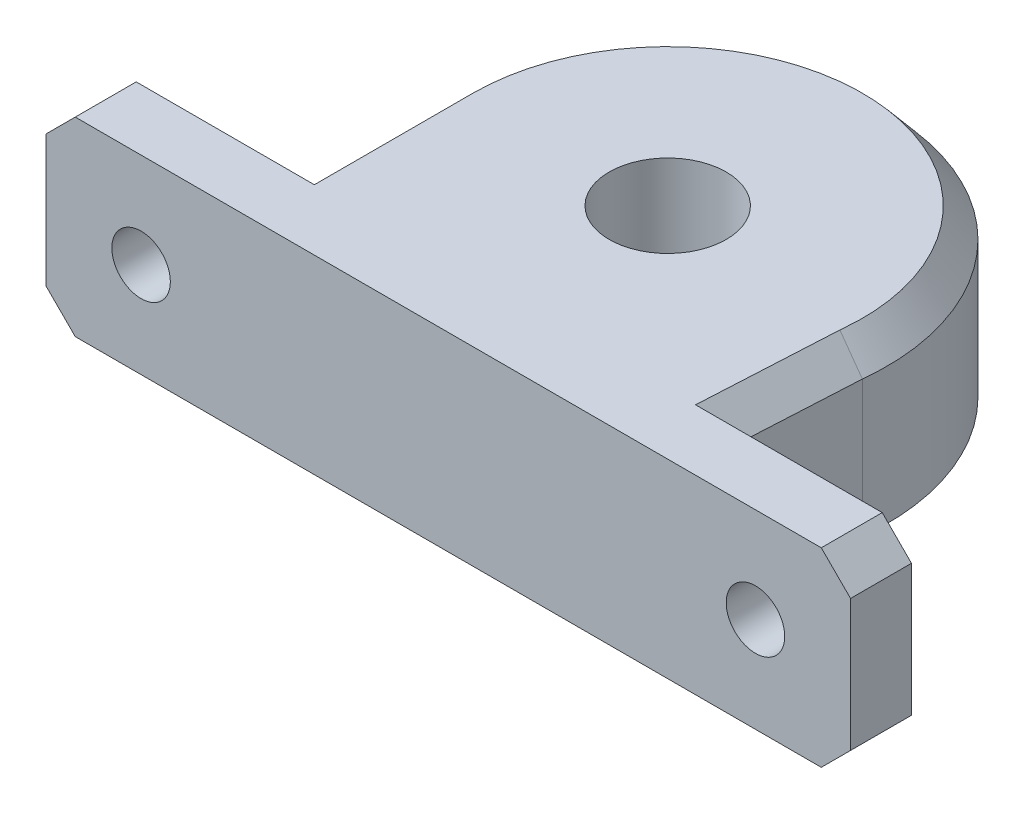
ISO-10303-21;
HEADER;
FILE_DESCRIPTION(('STEP AP214'),'2;1');
FILE_NAME('part.step','',(''),(''),'','','');
FILE_SCHEMA(('AUTOMOTIVE_DESIGN { 1 0 10303 214 1 1 1 1 }'));
ENDSEC;
DATA;
#1=APPLICATION_CONTEXT('core data for automotive mechanical design processes');
#2=APPLICATION_PROTOCOL_DEFINITION('international standard','automotive_design',2000,#1);
#3=PRODUCT_CONTEXT('',#1,'mechanical');
#4=PRODUCT('Part','Part','',(#3));
#5=PRODUCT_RELATED_PRODUCT_CATEGORY('part','',(#4));
#6=PRODUCT_DEFINITION_FORMATION('','',#4);
#7=PRODUCT_DEFINITION_CONTEXT('part definition',#1,'design');
#8=PRODUCT_DEFINITION('design','',#6,#7);
#9=PRODUCT_DEFINITION_SHAPE('','',#8);
#10=(LENGTH_UNIT() NAMED_UNIT(*) SI_UNIT(.MILLI.,.METRE.));
#11=(NAMED_UNIT(*) PLANE_ANGLE_UNIT() SI_UNIT($,.RADIAN.));
#12=(NAMED_UNIT(*) SI_UNIT($,.STERADIAN.) SOLID_ANGLE_UNIT());
#13=UNCERTAINTY_MEASURE_WITH_UNIT(LENGTH_MEASURE(1.E-05),#10,'distance_accuracy_value','');
#14=(GEOMETRIC_REPRESENTATION_CONTEXT(3) GLOBAL_UNCERTAINTY_ASSIGNED_CONTEXT((#13)) GLOBAL_UNIT_ASSIGNED_CONTEXT((#10,
#11,#12)) REPRESENTATION_CONTEXT('',''));
#15=CARTESIAN_POINT('',(0.,0.,0.));
#16=DIRECTION('',(0.,0.,1.));
#17=DIRECTION('',(1.,0.,0.));
#18=AXIS2_PLACEMENT_3D('',#15,#16,#17);
#19=CARTESIAN_POINT('',(0.,13.,-15.));
#20=DIRECTION('',(0.,1.,0.));
#21=DIRECTION('',(0.,0.,1.));
#22=AXIS2_PLACEMENT_3D('',#19,#20,#21);
#23=PLANE('',#22);
#24=DIRECTION('',(-1.,0.,0.));
#25=VECTOR('',#24,1.);
#26=CARTESIAN_POINT('',(-27.5,13.,0.));
#27=LINE('',#26,#25);
#28=CARTESIAN_POINT('',(25.5,13.,0.));
#29=VERTEX_POINT('',#28);
#30=CARTESIAN_POINT('',(-25.5,13.,0.));
#31=VERTEX_POINT('',#30);
#32=EDGE_CURVE('E353',#29,#31,#27,.T.);
#33=ORIENTED_EDGE('',*,*,#32,.F.);
#34=DIRECTION('',(0.,0.,-1.));
#35=VECTOR('',#34,1.);
#36=CARTESIAN_POINT('',(25.5,13.,-15.));
#37=LINE('',#36,#35);
#38=CARTESIAN_POINT('',(25.5,13.,-4.16634513511838));
#39=VERTEX_POINT('',#38);
#40=EDGE_CURVE('E264',#29,#39,#37,.T.);
#41=ORIENTED_EDGE('',*,*,#40,.T.);
#42=DIRECTION('',(1.,0.,0.));
#43=VECTOR('',#42,1.);
#44=CARTESIAN_POINT('',(27.5,13.,-4.16634513511838));
#45=LINE('',#44,#43);
#46=CARTESIAN_POINT('',(12.7381690096342,13.,-4.16634513511838));
#47=VERTEX_POINT('',#46);
#48=EDGE_CURVE('E290',#47,#39,#45,.T.);
#49=ORIENTED_EDGE('',*,*,#48,.F.);
#50=DIRECTION('',(0.0535722881047087,0.,-0.998563973888116));
#51=VECTOR('',#50,1.);
#52=CARTESIAN_POINT('',(13.2811608248155,13.,-14.2874746208782));
#53=LINE('',#52,#51);
#54=CARTESIAN_POINT('',(13.2405924293105,13.,-13.531297506499));
#55=VERTEX_POINT('',#54);
#56=EDGE_CURVE('E195',#47,#55,#53,.T.);
#57=ORIENTED_EDGE('',*,*,#56,.T.);
#58=CARTESIAN_POINT('',(0.,13.,-15.));
#59=DIRECTION('',(0.,1.,0.));
#60=DIRECTION('',(0.,0.,1.));
#61=AXIS2_PLACEMENT_3D('',#58,#59,#60);
#62=CIRCLE('',#61,13.3218007376454);
#63=CARTESIAN_POINT('',(-13.3218007376454,13.,-15.));
#64=VERTEX_POINT('',#63);
#65=EDGE_CURVE('E190',#55,#64,#62,.T.);
#66=ORIENTED_EDGE('',*,*,#65,.T.);
#67=DIRECTION('',(0.,0.,1.));
#68=VECTOR('',#67,1.);
#69=CARTESIAN_POINT('',(-13.3218007376454,13.,-15.));
#70=LINE('',#69,#68);
#71=CARTESIAN_POINT('',(-13.3218007376454,13.,-4.16634513511838));
#72=VERTEX_POINT('',#71);
#73=EDGE_CURVE('E192',#64,#72,#70,.T.);
#74=ORIENTED_EDGE('',*,*,#73,.T.);
#75=DIRECTION('',(1.,0.,0.));
#76=VECTOR('',#75,1.);
#77=CARTESIAN_POINT('',(-15.,13.,-4.16634513511838));
#78=LINE('',#77,#76);
#79=CARTESIAN_POINT('',(-25.5,13.,-4.16634513511838));
#80=VERTEX_POINT('',#79);
#81=EDGE_CURVE('E355',#80,#72,#78,.T.);
#82=ORIENTED_EDGE('',*,*,#81,.F.);
#83=DIRECTION('',(0.,0.,1.));
#84=VECTOR('',#83,1.);
#85=CARTESIAN_POINT('',(-25.5,13.,-15.));
#86=LINE('',#85,#84);
#87=EDGE_CURVE('E262',#80,#31,#86,.T.);
#88=ORIENTED_EDGE('',*,*,#87,.T.);
#89=EDGE_LOOP('',(#33,#41,#49,#57,#66,#74,#82,#88));
#90=FACE_BOUND('',#89,.T.);
#91=CARTESIAN_POINT('',(0.,13.,-15.));
#92=DIRECTION('',(0.,1.,0.));
#93=DIRECTION('',(0.,0.,1.));
#94=AXIS2_PLACEMENT_3D('',#91,#92,#93);
#95=CIRCLE('',#94,4.);
#96=CARTESIAN_POINT('',(0.,13.,-19.));
#97=VERTEX_POINT('',#96);
#98=EDGE_CURVE('E180',#97,#97,#95,.T.);
#99=ORIENTED_EDGE('',*,*,#98,.F.);
#100=EDGE_LOOP('',(#99));
#101=FACE_BOUND('',#100,.T.);
#102=ADVANCED_FACE('F36',(#90,#101),#23,.T.);
#103=CARTESIAN_POINT('',(0.,0.,-15.));
#104=DIRECTION('',(0.,1.,0.));
#105=DIRECTION('',(0.,0.,1.));
#106=AXIS2_PLACEMENT_3D('',#103,#104,#105);
#107=PLANE('',#106);
#108=DIRECTION('',(1.,0.,0.));
#109=VECTOR('',#108,1.);
#110=CARTESIAN_POINT('',(27.5,0.,-4.16634513511838));
#111=LINE('',#110,#109);
#112=CARTESIAN_POINT('',(12.4159054931642,0.,-4.16634513511838));
#113=VERTEX_POINT('',#112);
#114=CARTESIAN_POINT('',(25.5,0.,-4.16634513511838));
#115=VERTEX_POINT('',#114);
#116=EDGE_CURVE('E341',#113,#115,#111,.T.);
#117=ORIENTED_EDGE('',*,*,#116,.T.);
#118=DIRECTION('',(0.,0.,1.));
#119=VECTOR('',#118,1.);
#120=CARTESIAN_POINT('',(25.5,0.,0.));
#121=LINE('',#120,#119);
#122=CARTESIAN_POINT('',(25.5,0.,0.));
#123=VERTEX_POINT('',#122);
#124=EDGE_CURVE('E272',#115,#123,#121,.T.);
#125=ORIENTED_EDGE('',*,*,#124,.T.);
#126=DIRECTION('',(-1.,0.,0.));
#127=VECTOR('',#126,1.);
#128=CARTESIAN_POINT('',(0.,0.,0.));
#129=LINE('',#128,#127);
#130=CARTESIAN_POINT('',(-25.5,0.,0.));
#131=VERTEX_POINT('',#130);
#132=EDGE_CURVE('E309',#123,#131,#129,.T.);
#133=ORIENTED_EDGE('',*,*,#132,.T.);
#134=DIRECTION('',(0.,0.,-1.));
#135=VECTOR('',#134,1.);
#136=CARTESIAN_POINT('',(-25.5,0.,-4.16634513511838));
#137=LINE('',#136,#135);
#138=CARTESIAN_POINT('',(-25.5,0.,-4.16634513511838));
#139=VERTEX_POINT('',#138);
#140=EDGE_CURVE('E270',#131,#139,#137,.T.);
#141=ORIENTED_EDGE('',*,*,#140,.T.);
#142=DIRECTION('',(1.,0.,0.));
#143=VECTOR('',#142,1.);
#144=CARTESIAN_POINT('',(-15.,0.,-4.16634513511838));
#145=LINE('',#144,#143);
#146=CARTESIAN_POINT('',(-13.,0.,-4.16634513511838));
#147=VERTEX_POINT('',#146);
#148=EDGE_CURVE('E159',#139,#147,#145,.T.);
#149=ORIENTED_EDGE('',*,*,#148,.T.);
#150=DIRECTION('',(0.,0.,-1.));
#151=VECTOR('',#150,1.);
#152=CARTESIAN_POINT('',(-13.,0.,-15.));
#153=LINE('',#152,#151);
#154=CARTESIAN_POINT('',(-13.,0.,-15.));
#155=VERTEX_POINT('',#154);
#156=EDGE_CURVE('E149',#147,#155,#153,.T.);
#157=ORIENTED_EDGE('',*,*,#156,.T.);
#158=CARTESIAN_POINT('',(0.,0.,-15.));
#159=DIRECTION('',(0.,1.,0.));
#160=DIRECTION('',(0.,0.,1.));
#161=AXIS2_PLACEMENT_3D('',#158,#159,#160);
#162=CIRCLE('',#161,13.);
#163=CARTESIAN_POINT('',(12.9197471865997,0.,-13.5577335078608));
#164=VERTEX_POINT('',#163);
#165=EDGE_CURVE('E156',#155,#164,#162,.F.);
#166=ORIENTED_EDGE('',*,*,#165,.T.);
#167=DIRECTION('',(-0.0535722881047087,0.,0.998563973888116));
#168=VECTOR('',#167,1.);
#169=CARTESIAN_POINT('',(12.4216537278849,0.,-4.2734897113278));
#170=LINE('',#169,#168);
#171=EDGE_CURVE('E163',#164,#113,#170,.T.);
#172=ORIENTED_EDGE('',*,*,#171,.T.);
#173=EDGE_LOOP('',(#117,#125,#133,#141,#149,#157,#166,#172));
#174=FACE_BOUND('',#173,.T.);
#175=CARTESIAN_POINT('',(0.,0.,-15.));
#176=DIRECTION('',(0.,1.,0.));
#177=DIRECTION('',(0.,0.,1.));
#178=AXIS2_PLACEMENT_3D('',#175,#176,#177);
#179=CIRCLE('',#178,4.);
#180=CARTESIAN_POINT('',(0.,0.,-19.));
#181=VERTEX_POINT('',#180);
#182=EDGE_CURVE('E295',#181,#181,#179,.T.);
#183=ORIENTED_EDGE('',*,*,#182,.T.);
#184=EDGE_LOOP('',(#183));
#185=FACE_BOUND('',#184,.T.);
#186=ADVANCED_FACE('F152',(#174,#185),#107,.F.);
#187=CARTESIAN_POINT('',(0.,13.,-15.));
#188=DIRECTION('',(0.,-1.,0.));
#189=DIRECTION('',(0.,0.,-1.));
#190=AXIS2_PLACEMENT_3D('',#187,#188,#189);
#191=CYLINDRICAL_SURFACE('',#190,15.);
#192=DIRECTION('',(0.,-1.,0.));
#193=VECTOR('',#192,1.);
#194=CARTESIAN_POINT('',(-15.,13.,-15.));
#195=LINE('',#194,#193);
#196=CARTESIAN_POINT('',(-15.,11.,-15.));
#197=VERTEX_POINT('',#196);
#198=CARTESIAN_POINT('',(-15.,1.67819926235459,-15.));
#199=VERTEX_POINT('',#198);
#200=EDGE_CURVE('E288',#197,#199,#195,.T.);
#201=ORIENTED_EDGE('',*,*,#200,.F.);
#202=CARTESIAN_POINT('',(0.,11.,-15.));
#203=DIRECTION('',(0.,1.,0.));
#204=DIRECTION('',(0.,0.,1.));
#205=AXIS2_PLACEMENT_3D('',#202,#203,#204);
#206=CIRCLE('',#205,15.);
#207=CARTESIAN_POINT('',(14.9139002984168,11.,-13.3951392929964));
#208=VERTEX_POINT('',#207);
#209=EDGE_CURVE('E202',#197,#208,#206,.F.);
#210=ORIENTED_EDGE('',*,*,#209,.T.);
#211=DIRECTION('',(0.,-1.,0.));
#212=VECTOR('',#211,1.);
#213=CARTESIAN_POINT('',(14.9139002984168,13.,-13.3951392929964));
#214=LINE('',#213,#212);
#215=CARTESIAN_POINT('',(14.9139002984168,1.67819926235459,-13.3951392929964));
#216=VERTEX_POINT('',#215);
#217=EDGE_CURVE('E177',#208,#216,#214,.T.);
#218=ORIENTED_EDGE('',*,*,#217,.T.);
#219=CARTESIAN_POINT('',(0.,1.67819926235458,-15.));
#220=DIRECTION('',(0.,1.,0.));
#221=DIRECTION('',(0.,0.,1.));
#222=AXIS2_PLACEMENT_3D('',#219,#220,#221);
#223=CIRCLE('',#222,15.);
#224=EDGE_CURVE('E200',#216,#199,#223,.T.);
#225=ORIENTED_EDGE('',*,*,#224,.T.);
#226=EDGE_LOOP('',(#201,#210,#218,#225));
#227=FACE_BOUND('',#226,.T.);
#228=ADVANCED_FACE('F321',(#227),#191,.T.);
#229=CARTESIAN_POINT('',(0.,13.,-15.));
#230=DIRECTION('',(0.,-1.,0.));
#231=DIRECTION('',(0.,0.,-1.));
#232=AXIS2_PLACEMENT_3D('',#229,#230,#231);
#233=CYLINDRICAL_SURFACE('',#232,4.);
#234=CARTESIAN_POINT('',(0.,13.,-19.));
#235=CARTESIAN_POINT('',(0.,12.8645833333333,-19.));
#236=CARTESIAN_POINT('',(0.,12.7291666666667,-19.));
#237=CARTESIAN_POINT('',(0.,12.4583333333333,-19.));
#238=CARTESIAN_POINT('',(0.,12.3229166666667,-19.));
#239=CARTESIAN_POINT('',(0.,12.0520833333333,-19.));
#240=CARTESIAN_POINT('',(0.,11.9166666666667,-19.));
#241=CARTESIAN_POINT('',(0.,11.6458333333333,-19.));
#242=CARTESIAN_POINT('',(0.,11.5104166666667,-19.));
#243=CARTESIAN_POINT('',(0.,11.2395833333333,-19.));
#244=CARTESIAN_POINT('',(0.,11.1041666666667,-19.));
#245=CARTESIAN_POINT('',(0.,10.8333333333333,-19.));
#246=CARTESIAN_POINT('',(0.,10.6979166666667,-19.));
#247=CARTESIAN_POINT('',(0.,10.4270833333333,-19.));
#248=CARTESIAN_POINT('',(0.,10.2916666666667,-19.));
#249=CARTESIAN_POINT('',(0.,10.0208333333333,-19.));
#250=CARTESIAN_POINT('',(0.,9.88541666666667,-19.));
#251=CARTESIAN_POINT('',(0.,9.61458333333333,-19.));
#252=CARTESIAN_POINT('',(0.,9.47916666666667,-19.));
#253=CARTESIAN_POINT('',(0.,9.20833333333333,-19.));
#254=CARTESIAN_POINT('',(0.,9.07291666666667,-19.));
#255=CARTESIAN_POINT('',(0.,8.80208333333333,-19.));
#256=CARTESIAN_POINT('',(0.,8.66666666666667,-19.));
#257=CARTESIAN_POINT('',(0.,8.39583333333333,-19.));
#258=CARTESIAN_POINT('',(0.,8.26041666666667,-19.));
#259=CARTESIAN_POINT('',(0.,7.98958333333333,-19.));
#260=CARTESIAN_POINT('',(0.,7.85416666666667,-19.));
#261=CARTESIAN_POINT('',(0.,7.58333333333333,-19.));
#262=CARTESIAN_POINT('',(0.,7.44791666666667,-19.));
#263=CARTESIAN_POINT('',(0.,7.17708333333333,-19.));
#264=CARTESIAN_POINT('',(0.,7.04166666666667,-19.));
#265=CARTESIAN_POINT('',(0.,6.77083333333333,-19.));
#266=CARTESIAN_POINT('',(0.,6.63541666666667,-19.));
#267=CARTESIAN_POINT('',(0.,6.36458333333333,-19.));
#268=CARTESIAN_POINT('',(0.,6.22916666666667,-19.));
#269=CARTESIAN_POINT('',(0.,5.95833333333333,-19.));
#270=CARTESIAN_POINT('',(0.,5.82291666666667,-19.));
#271=CARTESIAN_POINT('',(0.,5.55208333333333,-19.));
#272=CARTESIAN_POINT('',(0.,5.41666666666667,-19.));
#273=CARTESIAN_POINT('',(0.,5.14583333333333,-19.));
#274=CARTESIAN_POINT('',(0.,5.01041666666667,-19.));
#275=CARTESIAN_POINT('',(0.,4.73958333333333,-19.));
#276=CARTESIAN_POINT('',(0.,4.60416666666667,-19.));
#277=CARTESIAN_POINT('',(0.,4.33333333333333,-19.));
#278=CARTESIAN_POINT('',(0.,4.19791666666667,-19.));
#279=CARTESIAN_POINT('',(0.,3.92708333333333,-19.));
#280=CARTESIAN_POINT('',(0.,3.79166666666667,-19.));
#281=CARTESIAN_POINT('',(0.,3.52083333333333,-19.));
#282=CARTESIAN_POINT('',(0.,3.38541666666667,-19.));
#283=CARTESIAN_POINT('',(0.,3.11458333333333,-19.));
#284=CARTESIAN_POINT('',(0.,2.97916666666667,-19.));
#285=CARTESIAN_POINT('',(0.,2.70833333333333,-19.));
#286=CARTESIAN_POINT('',(0.,2.57291666666667,-19.));
#287=CARTESIAN_POINT('',(0.,2.30208333333333,-19.));
#288=CARTESIAN_POINT('',(0.,2.16666666666667,-19.));
#289=CARTESIAN_POINT('',(0.,1.89583333333333,-19.));
#290=CARTESIAN_POINT('',(0.,1.76041666666667,-19.));
#291=CARTESIAN_POINT('',(0.,1.48958333333333,-19.));
#292=CARTESIAN_POINT('',(0.,1.35416666666667,-19.));
#293=CARTESIAN_POINT('',(0.,1.08333333333333,-19.));
#294=CARTESIAN_POINT('',(0.,0.947916666666667,-19.));
#295=CARTESIAN_POINT('',(0.,0.677083333333334,-19.));
#296=CARTESIAN_POINT('',(0.,0.541666666666667,-19.));
#297=CARTESIAN_POINT('',(0.,0.270833333333334,-19.));
#298=CARTESIAN_POINT('',(0.,0.135416666666667,-19.));
#299=CARTESIAN_POINT('',(0.,0.,-19.));
#300=B_SPLINE_CURVE_WITH_KNOTS('',3,(#234,#235,#236,#237,#238,#239,#240,#241,#242,#243,#244,
#245,#246,#247,#248,#249,#250,#251,#252,#253,#254,#255,#256,#257,#258,#259,#260,#261,#262,#263,
#264,#265,#266,#267,#268,#269,#270,#271,#272,#273,#274,#275,#276,#277,#278,#279,#280,#281,#282,
#283,#284,#285,#286,#287,#288,#289,#290,#291,#292,#293,#294,#295,#296,#297,#298,#299),
.UNSPECIFIED.,.F.,.F.,(4,2,2,2,2,2,2,2,2,2,2,2,2,2,2,2,2,2,2,2,2,2,2,2,2,2,2,2,2,2,2,2,4),(0.,
0.406249999999999,0.812499999999999,1.21875,1.625,2.03125,2.4375,2.84375,3.25,3.65625,4.0625,
4.46875,4.875,5.28125,5.6875,6.09375,6.5,6.90625,7.3125,7.71875,8.125,8.53125,8.9375,9.34375,
9.75,10.15625,10.5625,10.96875,11.375,11.78125,12.1875,12.59375,13.),.UNSPECIFIED.);
#301=EDGE_CURVE('BSEAM390',#97,#181,#300,.T.);
#302=ORIENTED_EDGE('',*,*,#98,.T.);
#303=ORIENTED_EDGE('',*,*,#182,.F.);
#304=ORIENTED_EDGE('',*,*,#301,.T.);
#305=ORIENTED_EDGE('',*,*,#301,.F.);
#306=EDGE_LOOP('',(#302,#304,#303,#305));
#307=FACE_BOUND('',#306,.T.);
#308=ADVANCED_FACE('F390',(#307),#233,.F.);
#309=CARTESIAN_POINT('',(0.,13.,0.));
#310=DIRECTION('',(0.,0.,1.));
#311=DIRECTION('',(1.,0.,0.));
#312=AXIS2_PLACEMENT_3D('',#309,#310,#311);
#313=PLANE('',#312);
#314=CARTESIAN_POINT('',(-21.,6.5,0.));
#315=DIRECTION('',(0.,0.,1.));
#316=DIRECTION('',(1.,0.,0.));
#317=AXIS2_PLACEMENT_3D('',#314,#315,#316);
#318=CIRCLE('',#317,2.);
#319=CARTESIAN_POINT('',(-19.,6.5,0.));
#320=VERTEX_POINT('',#319);
#321=EDGE_CURVE('E247',#320,#320,#318,.T.);
#322=ORIENTED_EDGE('',*,*,#321,.F.);
#323=EDGE_LOOP('',(#322));
#324=FACE_BOUND('',#323,.T.);
#325=CARTESIAN_POINT('',(21.,6.5,0.));
#326=DIRECTION('',(0.,0.,1.));
#327=DIRECTION('',(1.,0.,0.));
#328=AXIS2_PLACEMENT_3D('',#325,#326,#327);
#329=CIRCLE('',#328,2.);
#330=CARTESIAN_POINT('',(23.,6.5,0.));
#331=VERTEX_POINT('',#330);
#332=EDGE_CURVE('E422',#331,#331,#329,.T.);
#333=ORIENTED_EDGE('',*,*,#332,.F.);
#334=EDGE_LOOP('',(#333));
#335=FACE_BOUND('',#334,.T.);
#336=DIRECTION('',(0.,-1.,0.));
#337=VECTOR('',#336,1.);
#338=CARTESIAN_POINT('',(27.5,13.,0.));
#339=LINE('',#338,#337);
#340=CARTESIAN_POINT('',(27.5,11.,0.));
#341=VERTEX_POINT('',#340);
#342=CARTESIAN_POINT('',(27.5,2.00000000000002,0.));
#343=VERTEX_POINT('',#342);
#344=EDGE_CURVE('E297',#341,#343,#339,.T.);
#345=ORIENTED_EDGE('',*,*,#344,.F.);
#346=DIRECTION('',(0.707106781186549,-0.707106781186546,0.));
#347=VECTOR('',#346,1.);
#348=CARTESIAN_POINT('',(12.7499999999999,25.75,0.));
#349=LINE('',#348,#347);
#350=EDGE_CURVE('E260',#341,#29,#349,.F.);
#351=ORIENTED_EDGE('',*,*,#350,.T.);
#352=ORIENTED_EDGE('',*,*,#32,.T.);
#353=DIRECTION('',(0.707106781186549,0.707106781186546,0.));
#354=VECTOR('',#353,1.);
#355=CARTESIAN_POINT('',(-12.7499999999999,25.75,0.));
#356=LINE('',#355,#354);
#357=CARTESIAN_POINT('',(-27.5,11.,0.));
#358=VERTEX_POINT('',#357);
#359=EDGE_CURVE('E254',#31,#358,#356,.F.);
#360=ORIENTED_EDGE('',*,*,#359,.T.);
#361=DIRECTION('',(0.,-1.,0.));
#362=VECTOR('',#361,1.);
#363=CARTESIAN_POINT('',(-27.5,13.,0.));
#364=LINE('',#363,#362);
#365=CARTESIAN_POINT('',(-27.5,2.00000000000002,0.));
#366=VERTEX_POINT('',#365);
#367=EDGE_CURVE('E281',#358,#366,#364,.T.);
#368=ORIENTED_EDGE('',*,*,#367,.T.);
#369=DIRECTION('',(0.707106781186546,-0.707106781186549,0.));
#370=VECTOR('',#369,1.);
#371=CARTESIAN_POINT('',(-19.25,-6.24999999999998,0.));
#372=LINE('',#371,#370);
#373=EDGE_CURVE('E256',#366,#131,#372,.T.);
#374=ORIENTED_EDGE('',*,*,#373,.T.);
#375=ORIENTED_EDGE('',*,*,#132,.F.);
#376=DIRECTION('',(0.707106781186546,0.707106781186549,0.));
#377=VECTOR('',#376,1.);
#378=CARTESIAN_POINT('',(19.25,-6.24999999999998,0.));
#379=LINE('',#378,#377);
#380=EDGE_CURVE('E258',#123,#343,#379,.T.);
#381=ORIENTED_EDGE('',*,*,#380,.T.);
#382=EDGE_LOOP('',(#345,#351,#352,#360,#368,#374,#375,#381));
#383=FACE_BOUND('',#382,.T.);
#384=ADVANCED_FACE('F350',(#324,#335,#383),#313,.T.);
#385=CARTESIAN_POINT('',(14.4187816756611,13.,-4.16634513511838));
#386=DIRECTION('',(0.998563973888116,0.,0.0535722881047087));
#387=DIRECTION('',(0.0535722881047087,0.,-0.998563973888116));
#388=AXIS2_PLACEMENT_3D('',#385,#386,#387);
#389=PLANE('',#388);
#390=DIRECTION('',(0.,-1.,0.));
#391=VECTOR('',#390,1.);
#392=CARTESIAN_POINT('',(14.4187816756611,13.,-4.16634513511838));
#393=LINE('',#392,#391);
#394=CARTESIAN_POINT('',(14.4187816756611,11.,-4.16634513511838));
#395=VERTEX_POINT('',#394);
#396=CARTESIAN_POINT('',(14.4187816756611,1.67819926235459,-4.16634513511838));
#397=VERTEX_POINT('',#396);
#398=EDGE_CURVE('E306',#395,#397,#393,.T.);
#399=ORIENTED_EDGE('',*,*,#398,.T.);
#400=DIRECTION('',(0.0535722881047087,0.,-0.998563973888116));
#401=VECTOR('',#400,1.);
#402=CARTESIAN_POINT('',(14.9139002984168,1.67819926235458,-13.3951392929965));
#403=LINE('',#402,#401);
#404=EDGE_CURVE('E188',#397,#216,#403,.T.);
#405=ORIENTED_EDGE('',*,*,#404,.T.);
#406=ORIENTED_EDGE('',*,*,#217,.F.);
#407=DIRECTION('',(-0.0535722881047087,0.,0.998563973888116));
#408=VECTOR('',#407,1.);
#409=CARTESIAN_POINT('',(14.4187816756611,11.,-4.16634513511838));
#410=LINE('',#409,#408);
#411=EDGE_CURVE('E185',#208,#395,#410,.T.);
#412=ORIENTED_EDGE('',*,*,#411,.T.);
#413=EDGE_LOOP('',(#399,#405,#406,#412));
#414=FACE_BOUND('',#413,.T.);
#415=ADVANCED_FACE('F335',(#414),#389,.T.);
#416=CARTESIAN_POINT('',(27.5,13.,0.));
#417=DIRECTION('',(1.,0.,0.));
#418=DIRECTION('',(0.,0.,-1.));
#419=AXIS2_PLACEMENT_3D('',#416,#417,#418);
#420=PLANE('',#419);
#421=DIRECTION('',(0.,-1.,0.));
#422=VECTOR('',#421,1.);
#423=CARTESIAN_POINT('',(27.5,13.,-4.16634513511838));
#424=LINE('',#423,#422);
#425=CARTESIAN_POINT('',(27.5,11.,-4.16634513511838));
#426=VERTEX_POINT('',#425);
#427=CARTESIAN_POINT('',(27.5,2.00000000000002,-4.16634513511838));
#428=VERTEX_POINT('',#427);
#429=EDGE_CURVE('E300',#426,#428,#424,.T.);
#430=ORIENTED_EDGE('',*,*,#429,.F.);
#431=DIRECTION('',(0.,0.,1.));
#432=VECTOR('',#431,1.);
#433=CARTESIAN_POINT('',(27.5,11.,0.));
#434=LINE('',#433,#432);
#435=EDGE_CURVE('E251',#426,#341,#434,.T.);
#436=ORIENTED_EDGE('',*,*,#435,.T.);
#437=ORIENTED_EDGE('',*,*,#344,.T.);
#438=DIRECTION('',(0.,0.,-1.));
#439=VECTOR('',#438,1.);
#440=CARTESIAN_POINT('',(27.5,2.00000000000002,-4.16634513511838));
#441=LINE('',#440,#439);
#442=EDGE_CURVE('E213',#343,#428,#441,.T.);
#443=ORIENTED_EDGE('',*,*,#442,.T.);
#444=EDGE_LOOP('',(#430,#436,#437,#443));
#445=FACE_BOUND('',#444,.T.);
#446=ADVANCED_FACE('F371',(#445),#420,.T.);
#447=CARTESIAN_POINT('',(27.5,13.,-4.16634513511838));
#448=DIRECTION('',(0.,0.,-1.));
#449=DIRECTION('',(-1.,0.,0.));
#450=AXIS2_PLACEMENT_3D('',#447,#448,#449);
#451=PLANE('',#450);
#452=CARTESIAN_POINT('',(21.,6.5,-4.16634513511838));
#453=DIRECTION('',(0.,0.,-1.));
#454=DIRECTION('',(-1.,0.,0.));
#455=AXIS2_PLACEMENT_3D('',#452,#453,#454);
#456=CIRCLE('',#455,2.);
#457=CARTESIAN_POINT('',(19.,6.5,-4.16634513511838));
#458=VERTEX_POINT('',#457);
#459=EDGE_CURVE('E360',#458,#458,#456,.F.);
#460=ORIENTED_EDGE('',*,*,#459,.T.);
#461=EDGE_LOOP('',(#460));
#462=FACE_BOUND('',#461,.T.);
#463=ORIENTED_EDGE('',*,*,#48,.T.);
#464=DIRECTION('',(-0.707106781186549,0.707106781186546,0.));
#465=VECTOR('',#464,1.);
#466=CARTESIAN_POINT('',(26.5,12.,-4.16634513511838));
#467=LINE('',#466,#465);
#468=EDGE_CURVE('E268',#39,#426,#467,.F.);
#469=ORIENTED_EDGE('',*,*,#468,.T.);
#470=ORIENTED_EDGE('',*,*,#429,.T.);
#471=DIRECTION('',(-0.707106781186546,-0.707106781186549,0.));
#472=VECTOR('',#471,1.);
#473=CARTESIAN_POINT('',(33.,7.50000000000002,-4.16634513511838));
#474=LINE('',#473,#472);
#475=EDGE_CURVE('E266',#428,#115,#474,.T.);
#476=ORIENTED_EDGE('',*,*,#475,.T.);
#477=ORIENTED_EDGE('',*,*,#116,.F.);
#478=DIRECTION('',(0.766499039327524,0.642245453631228,0.));
#479=VECTOR('',#478,1.);
#480=CARTESIAN_POINT('',(12.7354678603868,0.267759601734694,-4.16634513511838));
#481=LINE('',#480,#479);
#482=EDGE_CURVE('E204',#113,#397,#481,.T.);
#483=ORIENTED_EDGE('',*,*,#482,.T.);
#484=ORIENTED_EDGE('',*,*,#398,.F.);
#485=DIRECTION('',(0.643329579155538,-0.765589349836816,0.));
#486=VECTOR('',#485,1.);
#487=CARTESIAN_POINT('',(14.4187816756611,11.,-4.16634513511838));
#488=LINE('',#487,#486);
#489=EDGE_CURVE('E206',#395,#47,#488,.F.);
#490=ORIENTED_EDGE('',*,*,#489,.T.);
#491=EDGE_LOOP('',(#463,#469,#470,#476,#477,#483,#484,#490));
#492=FACE_BOUND('',#491,.T.);
#493=ADVANCED_FACE('F339',(#462,#492),#451,.T.);
#494=CARTESIAN_POINT('',(-15.,13.,-15.));
#495=DIRECTION('',(-1.,0.,0.));
#496=DIRECTION('',(0.,0.,1.));
#497=AXIS2_PLACEMENT_3D('',#494,#495,#496);
#498=PLANE('',#497);
#499=DIRECTION('',(0.,-1.,0.));
#500=VECTOR('',#499,1.);
#501=CARTESIAN_POINT('',(-15.,13.,-4.16634513511838));
#502=LINE('',#501,#500);
#503=CARTESIAN_POINT('',(-15.,11.,-4.16634513511838));
#504=VERTEX_POINT('',#503);
#505=CARTESIAN_POINT('',(-15.,1.67819926235459,-4.16634513511838));
#506=VERTEX_POINT('',#505);
#507=EDGE_CURVE('E285',#504,#506,#502,.T.);
#508=ORIENTED_EDGE('',*,*,#507,.F.);
#509=DIRECTION('',(0.,0.,-1.));
#510=VECTOR('',#509,1.);
#511=CARTESIAN_POINT('',(-15.,11.,-15.));
#512=LINE('',#511,#510);
#513=EDGE_CURVE('E198',#504,#197,#512,.T.);
#514=ORIENTED_EDGE('',*,*,#513,.T.);
#515=ORIENTED_EDGE('',*,*,#200,.T.);
#516=DIRECTION('',(0.,0.,1.));
#517=VECTOR('',#516,1.);
#518=CARTESIAN_POINT('',(-15.,1.67819926235458,-4.16634513511838));
#519=LINE('',#518,#517);
#520=EDGE_CURVE('E169',#199,#506,#519,.T.);
#521=ORIENTED_EDGE('',*,*,#520,.T.);
#522=EDGE_LOOP('',(#508,#514,#515,#521));
#523=FACE_BOUND('',#522,.T.);
#524=ADVANCED_FACE('F317',(#523),#498,.T.);
#525=CARTESIAN_POINT('',(-15.,13.,-4.16634513511838));
#526=DIRECTION('',(0.,0.,-1.));
#527=DIRECTION('',(-1.,0.,0.));
#528=AXIS2_PLACEMENT_3D('',#525,#526,#527);
#529=PLANE('',#528);
#530=CARTESIAN_POINT('',(-21.,6.5,-4.16634513511838));
#531=DIRECTION('',(0.,0.,-1.));
#532=DIRECTION('',(-1.,0.,0.));
#533=AXIS2_PLACEMENT_3D('',#530,#531,#532);
#534=CIRCLE('',#533,2.);
#535=CARTESIAN_POINT('',(-23.,6.5,-4.16634513511838));
#536=VERTEX_POINT('',#535);
#537=EDGE_CURVE('E419',#536,#536,#534,.F.);
#538=ORIENTED_EDGE('',*,*,#537,.T.);
#539=EDGE_LOOP('',(#538));
#540=FACE_BOUND('',#539,.T.);
#541=ORIENTED_EDGE('',*,*,#148,.F.);
#542=DIRECTION('',(-0.707106781186546,0.707106781186549,0.));
#543=VECTOR('',#542,1.);
#544=CARTESIAN_POINT('',(-26.75,1.25000000000002,-4.16634513511838));
#545=LINE('',#544,#543);
#546=CARTESIAN_POINT('',(-27.5,2.00000000000002,-4.16634513511838));
#547=VERTEX_POINT('',#546);
#548=EDGE_CURVE('E51',#139,#547,#545,.T.);
#549=ORIENTED_EDGE('',*,*,#548,.T.);
#550=DIRECTION('',(0.,-1.,0.));
#551=VECTOR('',#550,1.);
#552=CARTESIAN_POINT('',(-27.5,13.,-4.16634513511838));
#553=LINE('',#552,#551);
#554=CARTESIAN_POINT('',(-27.5,11.,-4.16634513511838));
#555=VERTEX_POINT('',#554);
#556=EDGE_CURVE('E278',#555,#547,#553,.T.);
#557=ORIENTED_EDGE('',*,*,#556,.F.);
#558=DIRECTION('',(-0.707106781186549,-0.707106781186546,0.));
#559=VECTOR('',#558,1.);
#560=CARTESIAN_POINT('',(-20.25,18.25,-4.16634513511838));
#561=LINE('',#560,#559);
#562=EDGE_CURVE('E59',#555,#80,#561,.F.);
#563=ORIENTED_EDGE('',*,*,#562,.T.);
#564=ORIENTED_EDGE('',*,*,#81,.T.);
#565=DIRECTION('',(0.642787609686538,0.766044443118979,0.));
#566=VECTOR('',#565,1.);
#567=CARTESIAN_POINT('',(-15.,11.,-4.16634513511838));
#568=LINE('',#567,#566);
#569=EDGE_CURVE('E209',#72,#504,#568,.F.);
#570=ORIENTED_EDGE('',*,*,#569,.T.);
#571=ORIENTED_EDGE('',*,*,#507,.T.);
#572=DIRECTION('',(0.766044443118979,-0.642787609686538,0.));
#573=VECTOR('',#572,1.);
#574=CARTESIAN_POINT('',(-13.,0.,-4.16634513511838));
#575=LINE('',#574,#573);
#576=EDGE_CURVE('E211',#506,#147,#575,.T.);
#577=ORIENTED_EDGE('',*,*,#576,.T.);
#578=EDGE_LOOP('',(#541,#549,#557,#563,#564,#570,#571,#577));
#579=FACE_BOUND('',#578,.T.);
#580=ADVANCED_FACE('F283',(#540,#579),#529,.T.);
#581=CARTESIAN_POINT('',(-27.5,13.,-4.16634513511838));
#582=DIRECTION('',(-1.,0.,0.));
#583=DIRECTION('',(0.,0.,1.));
#584=AXIS2_PLACEMENT_3D('',#581,#582,#583);
#585=PLANE('',#584);
#586=ORIENTED_EDGE('',*,*,#556,.T.);
#587=DIRECTION('',(0.,0.,1.));
#588=VECTOR('',#587,1.);
#589=CARTESIAN_POINT('',(-27.5,2.00000000000002,0.));
#590=LINE('',#589,#588);
#591=EDGE_CURVE('E11',#547,#366,#590,.T.);
#592=ORIENTED_EDGE('',*,*,#591,.T.);
#593=ORIENTED_EDGE('',*,*,#367,.F.);
#594=DIRECTION('',(0.,0.,-1.));
#595=VECTOR('',#594,1.);
#596=CARTESIAN_POINT('',(-27.5,11.,-4.16634513511838));
#597=LINE('',#596,#595);
#598=EDGE_CURVE('E44',#358,#555,#597,.T.);
#599=ORIENTED_EDGE('',*,*,#598,.T.);
#600=EDGE_LOOP('',(#586,#592,#593,#599));
#601=FACE_BOUND('',#600,.T.);
#602=ADVANCED_FACE('F230',(#601),#585,.T.);
#603=CARTESIAN_POINT('',(-13.,0.,-15.));
#604=DIRECTION('',(-0.642787609686538,-0.766044443118979,0.));
#605=DIRECTION('',(0.,0.,1.));
#606=AXIS2_PLACEMENT_3D('',#603,#604,#605);
#607=PLANE('',#606);
#608=ORIENTED_EDGE('',*,*,#576,.F.);
#609=ORIENTED_EDGE('',*,*,#520,.F.);
#610=DIRECTION('',(-0.766044443118979,0.642787609686538,0.));
#611=VECTOR('',#610,1.);
#612=CARTESIAN_POINT('',(-13.,0.,-15.));
#613=LINE('',#612,#611);
#614=EDGE_CURVE('E167',#155,#199,#613,.T.);
#615=ORIENTED_EDGE('',*,*,#614,.F.);
#616=ORIENTED_EDGE('',*,*,#156,.F.);
#617=EDGE_LOOP('',(#608,#609,#615,#616));
#618=FACE_BOUND('',#617,.T.);
#619=ADVANCED_FACE('F168',(#618),#607,.T.);
#620=CARTESIAN_POINT('',(0.,1.67819926235458,-15.));
#621=DIRECTION('',(0.,1.,0.));
#622=DIRECTION('',(0.,0.,1.));
#623=AXIS2_PLACEMENT_3D('',#620,#621,#622);
#624=CONICAL_SURFACE('',#623,15.,0.872664625997166);
#625=ORIENTED_EDGE('',*,*,#614,.T.);
#626=ORIENTED_EDGE('',*,*,#224,.F.);
#627=CARTESIAN_POINT('',(14.9139002984168,1.67819926235458,-13.3951392929964));
#628=CARTESIAN_POINT('',(14.5815183353943,1.39849486356055,-13.4219081381113));
#629=CARTESIAN_POINT('',(14.2491479296156,1.1187927270793,-13.4488420784324));
#630=CARTESIAN_POINT('',(13.5844302256762,0.55939297296101,-13.503040150047));
#631=CARTESIAN_POINT('',(13.2520829275159,0.279695355324064,-13.5303042813473));
#632=CARTESIAN_POINT('',(12.9197471866,0.,-13.5577335078607));
#633=B_SPLINE_CURVE_WITH_KNOTS('',3,(#627,#628,#629,#630,#631,#632),.UNSPECIFIED.,.F.,.F.,(4,2,
4),(0.,1.3057026002799,2.61140522754852),.UNSPECIFIED.);
#634=EDGE_CURVE('E172',#164,#216,#633,.F.);
#635=ORIENTED_EDGE('',*,*,#634,.F.);
#636=ORIENTED_EDGE('',*,*,#165,.F.);
#637=EDGE_LOOP('',(#625,#626,#635,#636));
#638=FACE_BOUND('',#637,.T.);
#639=ADVANCED_FACE('F174',(#638),#624,.T.);
#640=CARTESIAN_POINT('',(12.9598222014321,0.,-14.3047142227077));
#641=DIRECTION('',(0.641864549894633,-0.766044443118979,0.0344356030162643));
#642=DIRECTION('',(0.0535722881047087,0.,-0.998563973888116));
#643=AXIS2_PLACEMENT_3D('',#640,#641,#642);
#644=PLANE('',#643);
#645=ORIENTED_EDGE('',*,*,#634,.T.);
#646=ORIENTED_EDGE('',*,*,#404,.F.);
#647=ORIENTED_EDGE('',*,*,#482,.F.);
#648=ORIENTED_EDGE('',*,*,#171,.F.);
#649=EDGE_LOOP('',(#645,#646,#647,#648));
#650=FACE_BOUND('',#649,.T.);
#651=ADVANCED_FACE('F222',(#650),#644,.T.);
#652=CARTESIAN_POINT('',(-15.,11.,-15.));
#653=DIRECTION('',(0.766044443118979,-0.642787609686538,0.));
#654=DIRECTION('',(0.,0.,-1.));
#655=AXIS2_PLACEMENT_3D('',#652,#653,#654);
#656=PLANE('',#655);
#657=ORIENTED_EDGE('',*,*,#569,.F.);
#658=ORIENTED_EDGE('',*,*,#73,.F.);
#659=DIRECTION('',(0.642787609686538,0.766044443118979,0.));
#660=VECTOR('',#659,1.);
#661=CARTESIAN_POINT('',(-15.,11.,-15.));
#662=LINE('',#661,#660);
#663=EDGE_CURVE('E220',#197,#64,#662,.T.);
#664=ORIENTED_EDGE('',*,*,#663,.F.);
#665=ORIENTED_EDGE('',*,*,#513,.F.);
#666=EDGE_LOOP('',(#657,#658,#664,#665));
#667=FACE_BOUND('',#666,.T.);
#668=ADVANCED_FACE('F327',(#667),#656,.F.);
#669=CARTESIAN_POINT('',(0.,13.,-15.));
#670=DIRECTION('',(0.,-1.,0.));
#671=DIRECTION('',(0.,0.,-1.));
#672=AXIS2_PLACEMENT_3D('',#669,#670,#671);
#673=CONICAL_SURFACE('',#672,13.3218007376454,0.69813170079773);
#674=ORIENTED_EDGE('',*,*,#663,.T.);
#675=ORIENTED_EDGE('',*,*,#65,.F.);
#676=CARTESIAN_POINT('',(13.2405924293105,13.,-13.531297506499));
#677=CARTESIAN_POINT('',(13.5194622011023,12.6666697772474,-13.5083759644536));
#678=CARTESIAN_POINT('',(13.798339409996,12.3333379985205,-13.4855686755928));
#679=CARTESIAN_POINT('',(14.3561086996981,11.6666713318539,-13.4401826044269));
#680=CARTESIAN_POINT('',(14.6350007805066,11.333336443914,-13.4176038221198));
#681=CARTESIAN_POINT('',(14.9139002984167,11.,-13.3951392929955));
#682=B_SPLINE_CURVE_WITH_KNOTS('',3,(#676,#677,#678,#679,#680,#681),.UNSPECIFIED.,.F.,.F.,(4,2,
4),(0.,1.30561276915176,2.61122552758888),.UNSPECIFIED.);
#683=EDGE_CURVE('E240',#208,#55,#682,.F.);
#684=ORIENTED_EDGE('',*,*,#683,.F.);
#685=ORIENTED_EDGE('',*,*,#209,.F.);
#686=EDGE_LOOP('',(#674,#675,#684,#685));
#687=FACE_BOUND('',#686,.T.);
#688=ADVANCED_FACE('F236',(#687),#673,.T.);
#689=CARTESIAN_POINT('',(14.4187816756611,11.,-4.16634513511838));
#690=DIRECTION('',(-0.764944383295797,-0.642787609686538,-0.0410387536077811));
#691=DIRECTION('',(-0.0535722881047087,0.,0.998563973888116));
#692=AXIS2_PLACEMENT_3D('',#689,#690,#691);
#693=PLANE('',#692);
#694=ORIENTED_EDGE('',*,*,#683,.T.);
#695=ORIENTED_EDGE('',*,*,#56,.F.);
#696=ORIENTED_EDGE('',*,*,#489,.F.);
#697=ORIENTED_EDGE('',*,*,#411,.F.);
#698=EDGE_LOOP('',(#694,#695,#696,#697));
#699=FACE_BOUND('',#698,.T.);
#700=ADVANCED_FACE('F231',(#699),#693,.F.);
#701=CARTESIAN_POINT('',(-21.,6.5,-30.001));
#702=DIRECTION('',(0.,0.,1.));
#703=DIRECTION('',(1.,0.,0.));
#704=AXIS2_PLACEMENT_3D('',#701,#702,#703);
#705=CYLINDRICAL_SURFACE('',#704,2.);
#706=ORIENTED_EDGE('',*,*,#537,.F.);
#707=EDGE_LOOP('',(#706));
#708=FACE_BOUND('',#707,.T.);
#709=ORIENTED_EDGE('',*,*,#321,.T.);
#710=EDGE_LOOP('',(#709));
#711=FACE_BOUND('',#710,.T.);
#712=ADVANCED_FACE('F235',(#708,#711),#705,.F.);
#713=CARTESIAN_POINT('',(21.,6.5,-30.001));
#714=DIRECTION('',(0.,0.,1.));
#715=DIRECTION('',(1.,0.,0.));
#716=AXIS2_PLACEMENT_3D('',#713,#714,#715);
#717=CYLINDRICAL_SURFACE('',#716,2.);
#718=ORIENTED_EDGE('',*,*,#459,.F.);
#719=EDGE_LOOP('',(#718));
#720=FACE_BOUND('',#719,.T.);
#721=ORIENTED_EDGE('',*,*,#332,.T.);
#722=EDGE_LOOP('',(#721));
#723=FACE_BOUND('',#722,.T.);
#724=ADVANCED_FACE('F408',(#720,#723),#717,.F.);
#725=CARTESIAN_POINT('',(27.5,11.,0.));
#726=DIRECTION('',(-0.707106781186546,-0.707106781186549,0.));
#727=DIRECTION('',(0.,0.,1.));
#728=AXIS2_PLACEMENT_3D('',#725,#726,#727);
#729=PLANE('',#728);
#730=ORIENTED_EDGE('',*,*,#468,.F.);
#731=ORIENTED_EDGE('',*,*,#40,.F.);
#732=ORIENTED_EDGE('',*,*,#350,.F.);
#733=ORIENTED_EDGE('',*,*,#435,.F.);
#734=EDGE_LOOP('',(#730,#731,#732,#733));
#735=FACE_BOUND('',#734,.T.);
#736=ADVANCED_FACE('F370',(#735),#729,.F.);
#737=CARTESIAN_POINT('',(25.5,0.,-15.));
#738=DIRECTION('',(0.707106781186549,-0.707106781186546,0.));
#739=DIRECTION('',(0.,0.,-1.));
#740=AXIS2_PLACEMENT_3D('',#737,#738,#739);
#741=PLANE('',#740);
#742=ORIENTED_EDGE('',*,*,#475,.F.);
#743=ORIENTED_EDGE('',*,*,#442,.F.);
#744=ORIENTED_EDGE('',*,*,#380,.F.);
#745=ORIENTED_EDGE('',*,*,#124,.F.);
#746=EDGE_LOOP('',(#742,#743,#744,#745));
#747=FACE_BOUND('',#746,.T.);
#748=ADVANCED_FACE('F348',(#747),#741,.T.);
#749=CARTESIAN_POINT('',(-25.5,0.,-15.));
#750=DIRECTION('',(-0.707106781186549,-0.707106781186546,0.));
#751=DIRECTION('',(0.,0.,1.));
#752=AXIS2_PLACEMENT_3D('',#749,#750,#751);
#753=PLANE('',#752);
#754=ORIENTED_EDGE('',*,*,#373,.F.);
#755=ORIENTED_EDGE('',*,*,#591,.F.);
#756=ORIENTED_EDGE('',*,*,#548,.F.);
#757=ORIENTED_EDGE('',*,*,#140,.F.);
#758=EDGE_LOOP('',(#754,#755,#756,#757));
#759=FACE_BOUND('',#758,.T.);
#760=ADVANCED_FACE('F476',(#759),#753,.T.);
#761=CARTESIAN_POINT('',(-27.5,11.,-4.16634513511838));
#762=DIRECTION('',(0.707106781186546,-0.707106781186549,0.));
#763=DIRECTION('',(0.,0.,-1.));
#764=AXIS2_PLACEMENT_3D('',#761,#762,#763);
#765=PLANE('',#764);
#766=ORIENTED_EDGE('',*,*,#359,.F.);
#767=ORIENTED_EDGE('',*,*,#87,.F.);
#768=ORIENTED_EDGE('',*,*,#562,.F.);
#769=ORIENTED_EDGE('',*,*,#598,.F.);
#770=EDGE_LOOP('',(#766,#767,#768,#769));
#771=FACE_BOUND('',#770,.T.);
#772=ADVANCED_FACE('F38',(#771),#765,.F.);
#773=CLOSED_SHELL('',(#102,#186,#228,#308,#384,#415,#446,#493,#524,#580,#602,#619,#639,#651,
#668,#688,#700,#712,#724,#736,#748,#760,#772));
#774=MANIFOLD_SOLID_BREP('B2',#773);
#775=ADVANCED_BREP_SHAPE_REPRESENTATION('',(#18,#774),#14);
#776=SHAPE_DEFINITION_REPRESENTATION(#9,#775);
ENDSEC;
END-ISO-10303-21;
